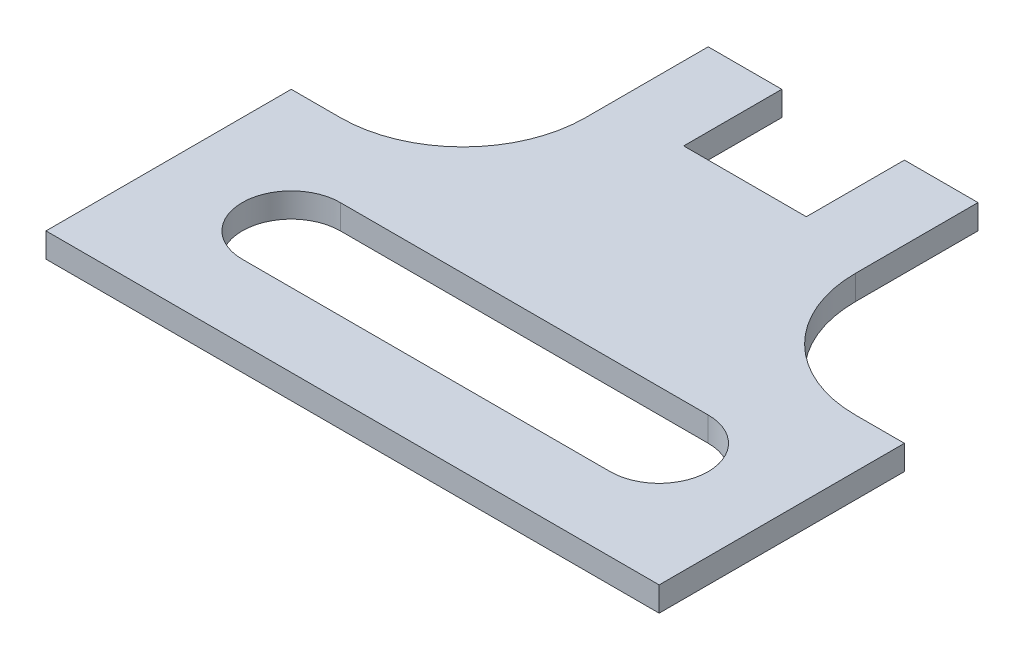
ISO-10303-21;
HEADER;
FILE_DESCRIPTION(('STEP AP214'),'2;1');
FILE_NAME('part.step','',(''),(''),'','','');
FILE_SCHEMA(('AUTOMOTIVE_DESIGN { 1 0 10303 214 1 1 1 1 }'));
ENDSEC;
DATA;
#1=APPLICATION_CONTEXT('core data for automotive mechanical design processes');
#2=APPLICATION_PROTOCOL_DEFINITION('international standard','automotive_design',2000,#1);
#3=PRODUCT_CONTEXT('',#1,'mechanical');
#4=PRODUCT('Part','Part','',(#3));
#5=PRODUCT_RELATED_PRODUCT_CATEGORY('part','',(#4));
#6=PRODUCT_DEFINITION_FORMATION('','',#4);
#7=PRODUCT_DEFINITION_CONTEXT('part definition',#1,'design');
#8=PRODUCT_DEFINITION('design','',#6,#7);
#9=PRODUCT_DEFINITION_SHAPE('','',#8);
#10=(LENGTH_UNIT() NAMED_UNIT(*) SI_UNIT(.MILLI.,.METRE.));
#11=(NAMED_UNIT(*) PLANE_ANGLE_UNIT() SI_UNIT($,.RADIAN.));
#12=(NAMED_UNIT(*) SI_UNIT($,.STERADIAN.) SOLID_ANGLE_UNIT());
#13=UNCERTAINTY_MEASURE_WITH_UNIT(LENGTH_MEASURE(1.E-05),#10,'distance_accuracy_value','');
#14=(GEOMETRIC_REPRESENTATION_CONTEXT(3) GLOBAL_UNCERTAINTY_ASSIGNED_CONTEXT((#13)) GLOBAL_UNIT_ASSIGNED_CONTEXT((#10,
#11,#12)) REPRESENTATION_CONTEXT('',''));
#15=CARTESIAN_POINT('',(0.,0.,0.));
#16=DIRECTION('',(0.,0.,1.));
#17=DIRECTION('',(1.,0.,0.));
#18=AXIS2_PLACEMENT_3D('',#15,#16,#17);
#19=CARTESIAN_POINT('',(2.,1.,-15.));
#20=DIRECTION('',(0.,-1.,0.));
#21=DIRECTION('',(0.,0.,-1.));
#22=AXIS2_PLACEMENT_3D('',#19,#20,#21);
#23=PLANE('',#22);
#24=DIRECTION('',(0.,0.,1.));
#25=VECTOR('',#24,1.);
#26=CARTESIAN_POINT('',(0.,1.,0.));
#27=LINE('',#26,#25);
#28=CARTESIAN_POINT('',(0.,1.,-10.));
#29=VERTEX_POINT('',#28);
#30=CARTESIAN_POINT('',(0.,1.,0.));
#31=VERTEX_POINT('',#30);
#32=EDGE_CURVE('E197',#29,#31,#27,.T.);
#33=ORIENTED_EDGE('',*,*,#32,.T.);
#34=DIRECTION('',(1.,0.,0.));
#35=VECTOR('',#34,1.);
#36=CARTESIAN_POINT('',(0.,1.,0.));
#37=LINE('',#36,#35);
#38=CARTESIAN_POINT('',(25.,1.,0.));
#39=VERTEX_POINT('',#38);
#40=EDGE_CURVE('E200',#31,#39,#37,.T.);
#41=ORIENTED_EDGE('',*,*,#40,.T.);
#42=DIRECTION('',(0.,0.,-1.));
#43=VECTOR('',#42,1.);
#44=CARTESIAN_POINT('',(25.,1.,0.));
#45=LINE('',#44,#43);
#46=CARTESIAN_POINT('',(25.,1.,-10.));
#47=VERTEX_POINT('',#46);
#48=EDGE_CURVE('E203',#39,#47,#45,.T.);
#49=ORIENTED_EDGE('',*,*,#48,.T.);
#50=DIRECTION('',(-1.,0.,0.));
#51=VECTOR('',#50,1.);
#52=CARTESIAN_POINT('',(23.,1.,-10.));
#53=LINE('',#52,#51);
#54=CARTESIAN_POINT('',(23.,1.,-10.));
#55=VERTEX_POINT('',#54);
#56=EDGE_CURVE('E205',#47,#55,#53,.T.);
#57=ORIENTED_EDGE('',*,*,#56,.T.);
#58=CARTESIAN_POINT('',(23.,1.,-15.));
#59=DIRECTION('',(0.,-1.,0.));
#60=DIRECTION('',(0.,0.,-1.));
#61=AXIS2_PLACEMENT_3D('',#58,#59,#60);
#62=CIRCLE('',#61,5.);
#63=CARTESIAN_POINT('',(18.,1.,-15.));
#64=VERTEX_POINT('',#63);
#65=EDGE_CURVE('E207',#55,#64,#62,.T.);
#66=ORIENTED_EDGE('',*,*,#65,.T.);
#67=DIRECTION('',(0.,0.,-1.));
#68=VECTOR('',#67,1.);
#69=CARTESIAN_POINT('',(18.,1.,-15.));
#70=LINE('',#69,#68);
#71=CARTESIAN_POINT('',(18.,1.,-20.));
#72=VERTEX_POINT('',#71);
#73=EDGE_CURVE('E209',#64,#72,#70,.T.);
#74=ORIENTED_EDGE('',*,*,#73,.T.);
#75=DIRECTION('',(-1.,0.,0.));
#76=VECTOR('',#75,1.);
#77=CARTESIAN_POINT('',(15.,1.,-20.));
#78=LINE('',#77,#76);
#79=CARTESIAN_POINT('',(15.,1.,-20.));
#80=VERTEX_POINT('',#79);
#81=EDGE_CURVE('E211',#72,#80,#78,.T.);
#82=ORIENTED_EDGE('',*,*,#81,.T.);
#83=DIRECTION('',(0.,0.,1.));
#84=VECTOR('',#83,1.);
#85=CARTESIAN_POINT('',(15.,1.,-20.));
#86=LINE('',#85,#84);
#87=CARTESIAN_POINT('',(15.,1.,-16.));
#88=VERTEX_POINT('',#87);
#89=EDGE_CURVE('E213',#80,#88,#86,.T.);
#90=ORIENTED_EDGE('',*,*,#89,.T.);
#91=DIRECTION('',(-1.,0.,0.));
#92=VECTOR('',#91,1.);
#93=CARTESIAN_POINT('',(10.,1.,-16.));
#94=LINE('',#93,#92);
#95=CARTESIAN_POINT('',(10.,1.,-16.));
#96=VERTEX_POINT('',#95);
#97=EDGE_CURVE('E215',#88,#96,#94,.T.);
#98=ORIENTED_EDGE('',*,*,#97,.T.);
#99=DIRECTION('',(0.,0.,-1.));
#100=VECTOR('',#99,1.);
#101=CARTESIAN_POINT('',(10.,1.,-20.));
#102=LINE('',#101,#100);
#103=CARTESIAN_POINT('',(10.,1.,-20.));
#104=VERTEX_POINT('',#103);
#105=EDGE_CURVE('E217',#96,#104,#102,.T.);
#106=ORIENTED_EDGE('',*,*,#105,.T.);
#107=DIRECTION('',(-1.,0.,0.));
#108=VECTOR('',#107,1.);
#109=CARTESIAN_POINT('',(7.,1.,-20.));
#110=LINE('',#109,#108);
#111=CARTESIAN_POINT('',(7.,1.,-20.));
#112=VERTEX_POINT('',#111);
#113=EDGE_CURVE('E219',#104,#112,#110,.T.);
#114=ORIENTED_EDGE('',*,*,#113,.T.);
#115=DIRECTION('',(0.,0.,1.));
#116=VECTOR('',#115,1.);
#117=CARTESIAN_POINT('',(7.,1.,-15.));
#118=LINE('',#117,#116);
#119=CARTESIAN_POINT('',(7.,1.,-15.));
#120=VERTEX_POINT('',#119);
#121=EDGE_CURVE('E221',#112,#120,#118,.T.);
#122=ORIENTED_EDGE('',*,*,#121,.T.);
#123=CARTESIAN_POINT('',(2.,1.,-15.));
#124=DIRECTION('',(0.,-1.,0.));
#125=DIRECTION('',(0.,0.,-1.));
#126=AXIS2_PLACEMENT_3D('',#123,#124,#125);
#127=CIRCLE('',#126,5.);
#128=CARTESIAN_POINT('',(2.,1.,-10.));
#129=VERTEX_POINT('',#128);
#130=EDGE_CURVE('E223',#120,#129,#127,.T.);
#131=ORIENTED_EDGE('',*,*,#130,.T.);
#132=DIRECTION('',(-1.,0.,0.));
#133=VECTOR('',#132,1.);
#134=CARTESIAN_POINT('',(0.,1.,-10.));
#135=LINE('',#134,#133);
#136=EDGE_CURVE('E225',#129,#29,#135,.T.);
#137=ORIENTED_EDGE('',*,*,#136,.T.);
#138=EDGE_LOOP('',(#33,#41,#49,#57,#66,#74,#82,#90,#98,#106,#114,#122,#131,#137));
#139=FACE_BOUND('',#138,.T.);
#140=CARTESIAN_POINT('',(5.,1.,-5.));
#141=DIRECTION('',(0.,1.,0.));
#142=DIRECTION('',(0.,0.,1.));
#143=AXIS2_PLACEMENT_3D('',#140,#141,#142);
#144=CIRCLE('',#143,2.);
#145=CARTESIAN_POINT('',(5.,1.,-7.));
#146=VERTEX_POINT('',#145);
#147=CARTESIAN_POINT('',(5.,1.,-3.));
#148=VERTEX_POINT('',#147);
#149=EDGE_CURVE('E161',#146,#148,#144,.T.);
#150=ORIENTED_EDGE('',*,*,#149,.F.);
#151=DIRECTION('',(-1.,0.,0.));
#152=VECTOR('',#151,1.);
#153=CARTESIAN_POINT('',(5.,1.,-7.));
#154=LINE('',#153,#152);
#155=CARTESIAN_POINT('',(20.,1.,-7.));
#156=VERTEX_POINT('',#155);
#157=EDGE_CURVE('E183',#156,#146,#154,.T.);
#158=ORIENTED_EDGE('',*,*,#157,.F.);
#159=CARTESIAN_POINT('',(20.,1.,-5.));
#160=DIRECTION('',(0.,1.,0.));
#161=DIRECTION('',(0.,0.,1.));
#162=AXIS2_PLACEMENT_3D('',#159,#160,#161);
#163=CIRCLE('',#162,2.);
#164=CARTESIAN_POINT('',(20.,1.,-3.));
#165=VERTEX_POINT('',#164);
#166=EDGE_CURVE('E181',#165,#156,#163,.T.);
#167=ORIENTED_EDGE('',*,*,#166,.F.);
#168=DIRECTION('',(1.,0.,0.));
#169=VECTOR('',#168,1.);
#170=CARTESIAN_POINT('',(5.,1.,-3.));
#171=LINE('',#170,#169);
#172=EDGE_CURVE('E169',#148,#165,#171,.T.);
#173=ORIENTED_EDGE('',*,*,#172,.F.);
#174=EDGE_LOOP('',(#150,#158,#167,#173));
#175=FACE_BOUND('',#174,.T.);
#176=ADVANCED_FACE('F36',(#139,#175),#23,.F.);
#177=CARTESIAN_POINT('',(2.,0.,-15.));
#178=DIRECTION('',(0.,-1.,0.));
#179=DIRECTION('',(0.,0.,-1.));
#180=AXIS2_PLACEMENT_3D('',#177,#178,#179);
#181=PLANE('',#180);
#182=DIRECTION('',(0.,0.,1.));
#183=VECTOR('',#182,1.);
#184=CARTESIAN_POINT('',(0.,0.,0.));
#185=LINE('',#184,#183);
#186=CARTESIAN_POINT('',(0.,0.,-10.));
#187=VERTEX_POINT('',#186);
#188=CARTESIAN_POINT('',(0.,0.,0.));
#189=VERTEX_POINT('',#188);
#190=EDGE_CURVE('E177',#187,#189,#185,.T.);
#191=ORIENTED_EDGE('',*,*,#190,.F.);
#192=DIRECTION('',(-1.,0.,0.));
#193=VECTOR('',#192,1.);
#194=CARTESIAN_POINT('',(0.,0.,-10.));
#195=LINE('',#194,#193);
#196=CARTESIAN_POINT('',(2.,0.,-10.));
#197=VERTEX_POINT('',#196);
#198=EDGE_CURVE('E201',#197,#187,#195,.T.);
#199=ORIENTED_EDGE('',*,*,#198,.F.);
#200=CARTESIAN_POINT('',(2.,0.,-15.));
#201=DIRECTION('',(0.,-1.,0.));
#202=DIRECTION('',(0.,0.,-1.));
#203=AXIS2_PLACEMENT_3D('',#200,#201,#202);
#204=CIRCLE('',#203,5.);
#205=CARTESIAN_POINT('',(7.,0.,-15.));
#206=VERTEX_POINT('',#205);
#207=EDGE_CURVE('E252',#206,#197,#204,.T.);
#208=ORIENTED_EDGE('',*,*,#207,.F.);
#209=DIRECTION('',(0.,0.,1.));
#210=VECTOR('',#209,1.);
#211=CARTESIAN_POINT('',(7.,0.,-15.));
#212=LINE('',#211,#210);
#213=CARTESIAN_POINT('',(7.,0.,-20.));
#214=VERTEX_POINT('',#213);
#215=EDGE_CURVE('E250',#214,#206,#212,.T.);
#216=ORIENTED_EDGE('',*,*,#215,.F.);
#217=DIRECTION('',(-1.,0.,0.));
#218=VECTOR('',#217,1.);
#219=CARTESIAN_POINT('',(7.,0.,-20.));
#220=LINE('',#219,#218);
#221=CARTESIAN_POINT('',(10.,0.,-20.));
#222=VERTEX_POINT('',#221);
#223=EDGE_CURVE('E248',#222,#214,#220,.T.);
#224=ORIENTED_EDGE('',*,*,#223,.F.);
#225=DIRECTION('',(0.,0.,-1.));
#226=VECTOR('',#225,1.);
#227=CARTESIAN_POINT('',(10.,0.,-20.));
#228=LINE('',#227,#226);
#229=CARTESIAN_POINT('',(10.,0.,-16.));
#230=VERTEX_POINT('',#229);
#231=EDGE_CURVE('E246',#230,#222,#228,.T.);
#232=ORIENTED_EDGE('',*,*,#231,.F.);
#233=DIRECTION('',(-1.,0.,0.));
#234=VECTOR('',#233,1.);
#235=CARTESIAN_POINT('',(10.,0.,-16.));
#236=LINE('',#235,#234);
#237=CARTESIAN_POINT('',(15.,0.,-16.));
#238=VERTEX_POINT('',#237);
#239=EDGE_CURVE('E244',#238,#230,#236,.T.);
#240=ORIENTED_EDGE('',*,*,#239,.F.);
#241=DIRECTION('',(0.,0.,1.));
#242=VECTOR('',#241,1.);
#243=CARTESIAN_POINT('',(15.,0.,-20.));
#244=LINE('',#243,#242);
#245=CARTESIAN_POINT('',(15.,0.,-20.));
#246=VERTEX_POINT('',#245);
#247=EDGE_CURVE('E242',#246,#238,#244,.T.);
#248=ORIENTED_EDGE('',*,*,#247,.F.);
#249=DIRECTION('',(-1.,0.,0.));
#250=VECTOR('',#249,1.);
#251=CARTESIAN_POINT('',(15.,0.,-20.));
#252=LINE('',#251,#250);
#253=CARTESIAN_POINT('',(18.,0.,-20.));
#254=VERTEX_POINT('',#253);
#255=EDGE_CURVE('E240',#254,#246,#252,.T.);
#256=ORIENTED_EDGE('',*,*,#255,.F.);
#257=DIRECTION('',(0.,0.,-1.));
#258=VECTOR('',#257,1.);
#259=CARTESIAN_POINT('',(18.,0.,-15.));
#260=LINE('',#259,#258);
#261=CARTESIAN_POINT('',(18.,0.,-15.));
#262=VERTEX_POINT('',#261);
#263=EDGE_CURVE('E238',#262,#254,#260,.T.);
#264=ORIENTED_EDGE('',*,*,#263,.F.);
#265=CARTESIAN_POINT('',(23.,0.,-15.));
#266=DIRECTION('',(0.,-1.,0.));
#267=DIRECTION('',(0.,0.,-1.));
#268=AXIS2_PLACEMENT_3D('',#265,#266,#267);
#269=CIRCLE('',#268,5.);
#270=CARTESIAN_POINT('',(23.,0.,-10.));
#271=VERTEX_POINT('',#270);
#272=EDGE_CURVE('E236',#271,#262,#269,.T.);
#273=ORIENTED_EDGE('',*,*,#272,.F.);
#274=DIRECTION('',(-1.,0.,0.));
#275=VECTOR('',#274,1.);
#276=CARTESIAN_POINT('',(23.,0.,-10.));
#277=LINE('',#276,#275);
#278=CARTESIAN_POINT('',(25.,0.,-10.));
#279=VERTEX_POINT('',#278);
#280=EDGE_CURVE('E234',#279,#271,#277,.T.);
#281=ORIENTED_EDGE('',*,*,#280,.F.);
#282=DIRECTION('',(0.,0.,-1.));
#283=VECTOR('',#282,1.);
#284=CARTESIAN_POINT('',(25.,0.,0.));
#285=LINE('',#284,#283);
#286=CARTESIAN_POINT('',(25.,0.,0.));
#287=VERTEX_POINT('',#286);
#288=EDGE_CURVE('E232',#287,#279,#285,.T.);
#289=ORIENTED_EDGE('',*,*,#288,.F.);
#290=DIRECTION('',(1.,0.,0.));
#291=VECTOR('',#290,1.);
#292=CARTESIAN_POINT('',(0.,0.,0.));
#293=LINE('',#292,#291);
#294=EDGE_CURVE('E230',#189,#287,#293,.T.);
#295=ORIENTED_EDGE('',*,*,#294,.F.);
#296=EDGE_LOOP('',(#191,#199,#208,#216,#224,#232,#240,#248,#256,#264,#273,#281,#289,#295));
#297=FACE_BOUND('',#296,.T.);
#298=DIRECTION('',(-1.,0.,0.));
#299=VECTOR('',#298,1.);
#300=CARTESIAN_POINT('',(5.,0.,-7.));
#301=LINE('',#300,#299);
#302=CARTESIAN_POINT('',(20.,0.,-7.));
#303=VERTEX_POINT('',#302);
#304=CARTESIAN_POINT('',(5.,0.,-7.));
#305=VERTEX_POINT('',#304);
#306=EDGE_CURVE('E170',#303,#305,#301,.T.);
#307=ORIENTED_EDGE('',*,*,#306,.T.);
#308=CARTESIAN_POINT('',(5.,0.,-5.));
#309=DIRECTION('',(0.,1.,0.));
#310=DIRECTION('',(0.,0.,1.));
#311=AXIS2_PLACEMENT_3D('',#308,#309,#310);
#312=CIRCLE('',#311,2.);
#313=CARTESIAN_POINT('',(5.,0.,-3.));
#314=VERTEX_POINT('',#313);
#315=EDGE_CURVE('E59',#305,#314,#312,.T.);
#316=ORIENTED_EDGE('',*,*,#315,.T.);
#317=DIRECTION('',(1.,0.,0.));
#318=VECTOR('',#317,1.);
#319=CARTESIAN_POINT('',(5.,0.,-3.));
#320=LINE('',#319,#318);
#321=CARTESIAN_POINT('',(20.,0.,-3.));
#322=VERTEX_POINT('',#321);
#323=EDGE_CURVE('E176',#314,#322,#320,.T.);
#324=ORIENTED_EDGE('',*,*,#323,.T.);
#325=CARTESIAN_POINT('',(20.,0.,-5.));
#326=DIRECTION('',(0.,1.,0.));
#327=DIRECTION('',(0.,0.,1.));
#328=AXIS2_PLACEMENT_3D('',#325,#326,#327);
#329=CIRCLE('',#328,2.);
#330=EDGE_CURVE('E189',#322,#303,#329,.T.);
#331=ORIENTED_EDGE('',*,*,#330,.T.);
#332=EDGE_LOOP('',(#307,#316,#324,#331));
#333=FACE_BOUND('',#332,.T.);
#334=ADVANCED_FACE('F300',(#297,#333),#181,.T.);
#335=CARTESIAN_POINT('',(0.,1.,0.));
#336=DIRECTION('',(1.,0.,0.));
#337=DIRECTION('',(0.,0.,-1.));
#338=AXIS2_PLACEMENT_3D('',#335,#336,#337);
#339=PLANE('',#338);
#340=ORIENTED_EDGE('',*,*,#190,.T.);
#341=DIRECTION('',(0.,-1.,0.));
#342=VECTOR('',#341,1.);
#343=CARTESIAN_POINT('',(0.,1.,0.));
#344=LINE('',#343,#342);
#345=EDGE_CURVE('E11',#31,#189,#344,.T.);
#346=ORIENTED_EDGE('',*,*,#345,.F.);
#347=ORIENTED_EDGE('',*,*,#32,.F.);
#348=DIRECTION('',(0.,-1.,0.));
#349=VECTOR('',#348,1.);
#350=CARTESIAN_POINT('',(0.,1.,-10.));
#351=LINE('',#350,#349);
#352=EDGE_CURVE('E227',#29,#187,#351,.T.);
#353=ORIENTED_EDGE('',*,*,#352,.T.);
#354=EDGE_LOOP('',(#340,#346,#347,#353));
#355=FACE_BOUND('',#354,.T.);
#356=ADVANCED_FACE('F38',(#355),#339,.F.);
#357=CARTESIAN_POINT('',(0.,1.,0.));
#358=DIRECTION('',(0.,0.,-1.));
#359=DIRECTION('',(-1.,0.,0.));
#360=AXIS2_PLACEMENT_3D('',#357,#358,#359);
#361=PLANE('',#360);
#362=ORIENTED_EDGE('',*,*,#294,.T.);
#363=DIRECTION('',(0.,-1.,0.));
#364=VECTOR('',#363,1.);
#365=CARTESIAN_POINT('',(25.,1.,0.));
#366=LINE('',#365,#364);
#367=EDGE_CURVE('E44',#39,#287,#366,.T.);
#368=ORIENTED_EDGE('',*,*,#367,.F.);
#369=ORIENTED_EDGE('',*,*,#40,.F.);
#370=ORIENTED_EDGE('',*,*,#345,.T.);
#371=EDGE_LOOP('',(#362,#368,#369,#370));
#372=FACE_BOUND('',#371,.T.);
#373=ADVANCED_FACE('F317',(#372),#361,.F.);
#374=CARTESIAN_POINT('',(25.,1.,0.));
#375=DIRECTION('',(-1.,0.,0.));
#376=DIRECTION('',(0.,0.,1.));
#377=AXIS2_PLACEMENT_3D('',#374,#375,#376);
#378=PLANE('',#377);
#379=ORIENTED_EDGE('',*,*,#288,.T.);
#380=DIRECTION('',(0.,-1.,0.));
#381=VECTOR('',#380,1.);
#382=CARTESIAN_POINT('',(25.,1.,-10.));
#383=LINE('',#382,#381);
#384=EDGE_CURVE('E287',#47,#279,#383,.T.);
#385=ORIENTED_EDGE('',*,*,#384,.F.);
#386=ORIENTED_EDGE('',*,*,#48,.F.);
#387=ORIENTED_EDGE('',*,*,#367,.T.);
#388=EDGE_LOOP('',(#379,#385,#386,#387));
#389=FACE_BOUND('',#388,.T.);
#390=ADVANCED_FACE('F294',(#389),#378,.F.);
#391=CARTESIAN_POINT('',(23.,1.,-10.));
#392=DIRECTION('',(0.,0.,1.));
#393=DIRECTION('',(1.,0.,0.));
#394=AXIS2_PLACEMENT_3D('',#391,#392,#393);
#395=PLANE('',#394);
#396=ORIENTED_EDGE('',*,*,#280,.T.);
#397=DIRECTION('',(0.,-1.,0.));
#398=VECTOR('',#397,1.);
#399=CARTESIAN_POINT('',(23.,1.,-10.));
#400=LINE('',#399,#398);
#401=EDGE_CURVE('E284',#55,#271,#400,.T.);
#402=ORIENTED_EDGE('',*,*,#401,.F.);
#403=ORIENTED_EDGE('',*,*,#56,.F.);
#404=ORIENTED_EDGE('',*,*,#384,.T.);
#405=EDGE_LOOP('',(#396,#402,#403,#404));
#406=FACE_BOUND('',#405,.T.);
#407=ADVANCED_FACE('F306',(#406),#395,.F.);
#408=CARTESIAN_POINT('',(23.,1.,-15.));
#409=DIRECTION('',(0.,-1.,0.));
#410=DIRECTION('',(0.,0.,-1.));
#411=AXIS2_PLACEMENT_3D('',#408,#409,#410);
#412=CYLINDRICAL_SURFACE('',#411,5.);
#413=ORIENTED_EDGE('',*,*,#272,.T.);
#414=DIRECTION('',(0.,-1.,0.));
#415=VECTOR('',#414,1.);
#416=CARTESIAN_POINT('',(18.,1.,-15.));
#417=LINE('',#416,#415);
#418=EDGE_CURVE('E281',#64,#262,#417,.T.);
#419=ORIENTED_EDGE('',*,*,#418,.F.);
#420=ORIENTED_EDGE('',*,*,#65,.F.);
#421=ORIENTED_EDGE('',*,*,#401,.T.);
#422=EDGE_LOOP('',(#413,#419,#420,#421));
#423=FACE_BOUND('',#422,.T.);
#424=ADVANCED_FACE('F310',(#423),#412,.F.);
#425=CARTESIAN_POINT('',(18.,1.,-15.));
#426=DIRECTION('',(-1.,0.,0.));
#427=DIRECTION('',(0.,0.,1.));
#428=AXIS2_PLACEMENT_3D('',#425,#426,#427);
#429=PLANE('',#428);
#430=ORIENTED_EDGE('',*,*,#263,.T.);
#431=DIRECTION('',(0.,-1.,0.));
#432=VECTOR('',#431,1.);
#433=CARTESIAN_POINT('',(18.,1.,-20.));
#434=LINE('',#433,#432);
#435=EDGE_CURVE('E278',#72,#254,#434,.T.);
#436=ORIENTED_EDGE('',*,*,#435,.F.);
#437=ORIENTED_EDGE('',*,*,#73,.F.);
#438=ORIENTED_EDGE('',*,*,#418,.T.);
#439=EDGE_LOOP('',(#430,#436,#437,#438));
#440=FACE_BOUND('',#439,.T.);
#441=ADVANCED_FACE('F360',(#440),#429,.F.);
#442=CARTESIAN_POINT('',(15.,1.,-20.));
#443=DIRECTION('',(0.,0.,1.));
#444=DIRECTION('',(1.,0.,0.));
#445=AXIS2_PLACEMENT_3D('',#442,#443,#444);
#446=PLANE('',#445);
#447=ORIENTED_EDGE('',*,*,#255,.T.);
#448=DIRECTION('',(0.,-1.,0.));
#449=VECTOR('',#448,1.);
#450=CARTESIAN_POINT('',(15.,1.,-20.));
#451=LINE('',#450,#449);
#452=EDGE_CURVE('E275',#80,#246,#451,.T.);
#453=ORIENTED_EDGE('',*,*,#452,.F.);
#454=ORIENTED_EDGE('',*,*,#81,.F.);
#455=ORIENTED_EDGE('',*,*,#435,.T.);
#456=EDGE_LOOP('',(#447,#453,#454,#455));
#457=FACE_BOUND('',#456,.T.);
#458=ADVANCED_FACE('F358',(#457),#446,.F.);
#459=CARTESIAN_POINT('',(15.,1.,-20.));
#460=DIRECTION('',(1.,0.,0.));
#461=DIRECTION('',(0.,0.,-1.));
#462=AXIS2_PLACEMENT_3D('',#459,#460,#461);
#463=PLANE('',#462);
#464=ORIENTED_EDGE('',*,*,#247,.T.);
#465=DIRECTION('',(0.,-1.,0.));
#466=VECTOR('',#465,1.);
#467=CARTESIAN_POINT('',(15.,1.,-16.));
#468=LINE('',#467,#466);
#469=EDGE_CURVE('E272',#88,#238,#468,.T.);
#470=ORIENTED_EDGE('',*,*,#469,.F.);
#471=ORIENTED_EDGE('',*,*,#89,.F.);
#472=ORIENTED_EDGE('',*,*,#452,.T.);
#473=EDGE_LOOP('',(#464,#470,#471,#472));
#474=FACE_BOUND('',#473,.T.);
#475=ADVANCED_FACE('F353',(#474),#463,.F.);
#476=CARTESIAN_POINT('',(10.,1.,-16.));
#477=DIRECTION('',(0.,0.,1.));
#478=DIRECTION('',(1.,0.,0.));
#479=AXIS2_PLACEMENT_3D('',#476,#477,#478);
#480=PLANE('',#479);
#481=ORIENTED_EDGE('',*,*,#239,.T.);
#482=DIRECTION('',(0.,-1.,0.));
#483=VECTOR('',#482,1.);
#484=CARTESIAN_POINT('',(10.,1.,-16.));
#485=LINE('',#484,#483);
#486=EDGE_CURVE('E269',#96,#230,#485,.T.);
#487=ORIENTED_EDGE('',*,*,#486,.F.);
#488=ORIENTED_EDGE('',*,*,#97,.F.);
#489=ORIENTED_EDGE('',*,*,#469,.T.);
#490=EDGE_LOOP('',(#481,#487,#488,#489));
#491=FACE_BOUND('',#490,.T.);
#492=ADVANCED_FACE('F348',(#491),#480,.F.);
#493=CARTESIAN_POINT('',(10.,1.,-20.));
#494=DIRECTION('',(-1.,0.,0.));
#495=DIRECTION('',(0.,0.,1.));
#496=AXIS2_PLACEMENT_3D('',#493,#494,#495);
#497=PLANE('',#496);
#498=ORIENTED_EDGE('',*,*,#231,.T.);
#499=DIRECTION('',(0.,-1.,0.));
#500=VECTOR('',#499,1.);
#501=CARTESIAN_POINT('',(10.,1.,-20.));
#502=LINE('',#501,#500);
#503=EDGE_CURVE('E266',#104,#222,#502,.T.);
#504=ORIENTED_EDGE('',*,*,#503,.F.);
#505=ORIENTED_EDGE('',*,*,#105,.F.);
#506=ORIENTED_EDGE('',*,*,#486,.T.);
#507=EDGE_LOOP('',(#498,#504,#505,#506));
#508=FACE_BOUND('',#507,.T.);
#509=ADVANCED_FACE('F344',(#508),#497,.F.);
#510=CARTESIAN_POINT('',(7.,1.,-20.));
#511=DIRECTION('',(0.,0.,1.));
#512=DIRECTION('',(1.,0.,0.));
#513=AXIS2_PLACEMENT_3D('',#510,#511,#512);
#514=PLANE('',#513);
#515=ORIENTED_EDGE('',*,*,#223,.T.);
#516=DIRECTION('',(0.,-1.,0.));
#517=VECTOR('',#516,1.);
#518=CARTESIAN_POINT('',(7.,1.,-20.));
#519=LINE('',#518,#517);
#520=EDGE_CURVE('E263',#112,#214,#519,.T.);
#521=ORIENTED_EDGE('',*,*,#520,.F.);
#522=ORIENTED_EDGE('',*,*,#113,.F.);
#523=ORIENTED_EDGE('',*,*,#503,.T.);
#524=EDGE_LOOP('',(#515,#521,#522,#523));
#525=FACE_BOUND('',#524,.T.);
#526=ADVANCED_FACE('F339',(#525),#514,.F.);
#527=CARTESIAN_POINT('',(7.,1.,-15.));
#528=DIRECTION('',(1.,0.,0.));
#529=DIRECTION('',(0.,0.,-1.));
#530=AXIS2_PLACEMENT_3D('',#527,#528,#529);
#531=PLANE('',#530);
#532=ORIENTED_EDGE('',*,*,#215,.T.);
#533=DIRECTION('',(0.,-1.,0.));
#534=VECTOR('',#533,1.);
#535=CARTESIAN_POINT('',(7.,1.,-15.));
#536=LINE('',#535,#534);
#537=EDGE_CURVE('E260',#120,#206,#536,.T.);
#538=ORIENTED_EDGE('',*,*,#537,.F.);
#539=ORIENTED_EDGE('',*,*,#121,.F.);
#540=ORIENTED_EDGE('',*,*,#520,.T.);
#541=EDGE_LOOP('',(#532,#538,#539,#540));
#542=FACE_BOUND('',#541,.T.);
#543=ADVANCED_FACE('F333',(#542),#531,.F.);
#544=CARTESIAN_POINT('',(2.,1.,-15.));
#545=DIRECTION('',(0.,-1.,0.));
#546=DIRECTION('',(0.,0.,-1.));
#547=AXIS2_PLACEMENT_3D('',#544,#545,#546);
#548=CYLINDRICAL_SURFACE('',#547,5.);
#549=ORIENTED_EDGE('',*,*,#207,.T.);
#550=DIRECTION('',(0.,-1.,0.));
#551=VECTOR('',#550,1.);
#552=CARTESIAN_POINT('',(2.,1.,-10.));
#553=LINE('',#552,#551);
#554=EDGE_CURVE('E257',#129,#197,#553,.T.);
#555=ORIENTED_EDGE('',*,*,#554,.F.);
#556=ORIENTED_EDGE('',*,*,#130,.F.);
#557=ORIENTED_EDGE('',*,*,#537,.T.);
#558=EDGE_LOOP('',(#549,#555,#556,#557));
#559=FACE_BOUND('',#558,.T.);
#560=ADVANCED_FACE('F329',(#559),#548,.F.);
#561=CARTESIAN_POINT('',(0.,1.,-10.));
#562=DIRECTION('',(0.,0.,1.));
#563=DIRECTION('',(1.,0.,0.));
#564=AXIS2_PLACEMENT_3D('',#561,#562,#563);
#565=PLANE('',#564);
#566=ORIENTED_EDGE('',*,*,#198,.T.);
#567=ORIENTED_EDGE('',*,*,#352,.F.);
#568=ORIENTED_EDGE('',*,*,#136,.F.);
#569=ORIENTED_EDGE('',*,*,#554,.T.);
#570=EDGE_LOOP('',(#566,#567,#568,#569));
#571=FACE_BOUND('',#570,.T.);
#572=ADVANCED_FACE('F324',(#571),#565,.F.);
#573=CARTESIAN_POINT('',(5.,1.,-5.));
#574=DIRECTION('',(0.,-1.,0.));
#575=DIRECTION('',(0.,0.,-1.));
#576=AXIS2_PLACEMENT_3D('',#573,#574,#575);
#577=CYLINDRICAL_SURFACE('',#576,2.);
#578=ORIENTED_EDGE('',*,*,#315,.F.);
#579=DIRECTION('',(0.,-1.,0.));
#580=VECTOR('',#579,1.);
#581=CARTESIAN_POINT('',(5.,1.,-7.));
#582=LINE('',#581,#580);
#583=EDGE_CURVE('E165',#146,#305,#582,.T.);
#584=ORIENTED_EDGE('',*,*,#583,.F.);
#585=ORIENTED_EDGE('',*,*,#149,.T.);
#586=DIRECTION('',(0.,-1.,0.));
#587=VECTOR('',#586,1.);
#588=CARTESIAN_POINT('',(5.,1.,-3.));
#589=LINE('',#588,#587);
#590=EDGE_CURVE('E164',#148,#314,#589,.T.);
#591=ORIENTED_EDGE('',*,*,#590,.T.);
#592=EDGE_LOOP('',(#578,#584,#585,#591));
#593=FACE_BOUND('',#592,.T.);
#594=ADVANCED_FACE('F163',(#593),#577,.F.);
#595=CARTESIAN_POINT('',(5.,1.,-3.));
#596=DIRECTION('',(0.,0.,-1.));
#597=DIRECTION('',(-1.,0.,0.));
#598=AXIS2_PLACEMENT_3D('',#595,#596,#597);
#599=PLANE('',#598);
#600=ORIENTED_EDGE('',*,*,#323,.F.);
#601=ORIENTED_EDGE('',*,*,#590,.F.);
#602=ORIENTED_EDGE('',*,*,#172,.T.);
#603=DIRECTION('',(0.,-1.,0.));
#604=VECTOR('',#603,1.);
#605=CARTESIAN_POINT('',(20.,1.,-3.));
#606=LINE('',#605,#604);
#607=EDGE_CURVE('E178',#165,#322,#606,.T.);
#608=ORIENTED_EDGE('',*,*,#607,.T.);
#609=EDGE_LOOP('',(#600,#601,#602,#608));
#610=FACE_BOUND('',#609,.T.);
#611=ADVANCED_FACE('F173',(#610),#599,.T.);
#612=CARTESIAN_POINT('',(20.,1.,-5.));
#613=DIRECTION('',(0.,-1.,0.));
#614=DIRECTION('',(0.,0.,-1.));
#615=AXIS2_PLACEMENT_3D('',#612,#613,#614);
#616=CYLINDRICAL_SURFACE('',#615,2.);
#617=ORIENTED_EDGE('',*,*,#330,.F.);
#618=ORIENTED_EDGE('',*,*,#607,.F.);
#619=ORIENTED_EDGE('',*,*,#166,.T.);
#620=DIRECTION('',(0.,-1.,0.));
#621=VECTOR('',#620,1.);
#622=CARTESIAN_POINT('',(20.,1.,-7.));
#623=LINE('',#622,#621);
#624=EDGE_CURVE('E51',#156,#303,#623,.T.);
#625=ORIENTED_EDGE('',*,*,#624,.T.);
#626=EDGE_LOOP('',(#617,#618,#619,#625));
#627=FACE_BOUND('',#626,.T.);
#628=ADVANCED_FACE('F431',(#627),#616,.F.);
#629=CARTESIAN_POINT('',(5.,1.,-7.));
#630=DIRECTION('',(0.,0.,1.));
#631=DIRECTION('',(1.,0.,0.));
#632=AXIS2_PLACEMENT_3D('',#629,#630,#631);
#633=PLANE('',#632);
#634=ORIENTED_EDGE('',*,*,#306,.F.);
#635=ORIENTED_EDGE('',*,*,#624,.F.);
#636=ORIENTED_EDGE('',*,*,#157,.T.);
#637=ORIENTED_EDGE('',*,*,#583,.T.);
#638=EDGE_LOOP('',(#634,#635,#636,#637));
#639=FACE_BOUND('',#638,.T.);
#640=ADVANCED_FACE('F437',(#639),#633,.T.);
#641=CLOSED_SHELL('',(#176,#334,#356,#373,#390,#407,#424,#441,#458,#475,#492,#509,#526,#543,
#560,#572,#594,#611,#628,#640));
#642=MANIFOLD_SOLID_BREP('B2',#641);
#643=ADVANCED_BREP_SHAPE_REPRESENTATION('',(#18,#642),#14);
#644=SHAPE_DEFINITION_REPRESENTATION(#9,#643);
ENDSEC;
END-ISO-10303-21;
